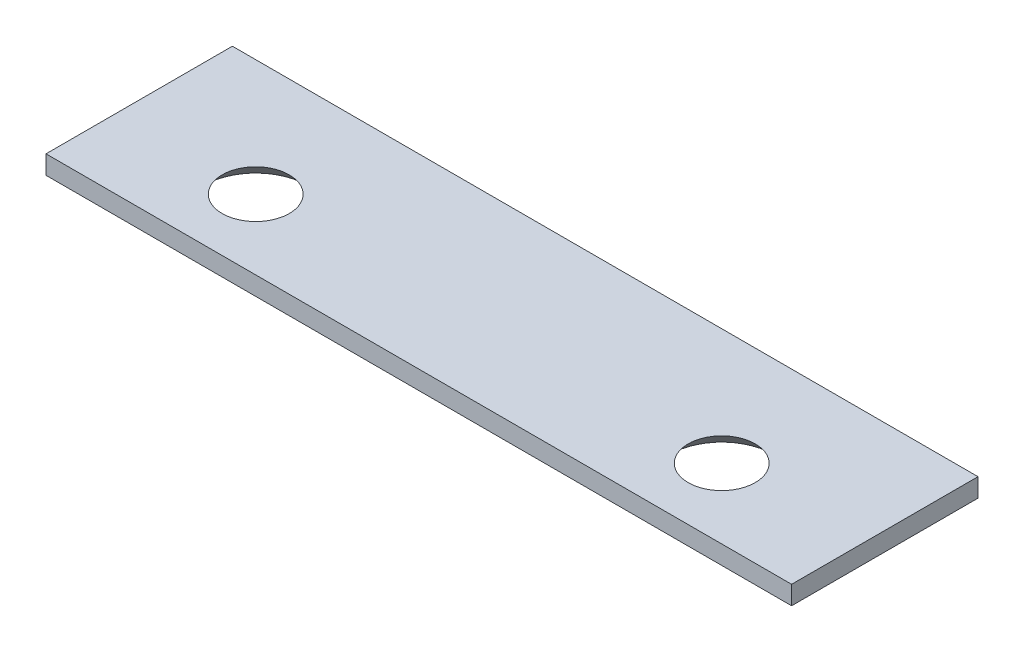
ISO-10303-21;
HEADER;
FILE_DESCRIPTION(('STEP AP214'),'2;1');
FILE_NAME('part.step','',(''),(''),'','','');
FILE_SCHEMA(('AUTOMOTIVE_DESIGN { 1 0 10303 214 1 1 1 1 }'));
ENDSEC;
DATA;
#1=APPLICATION_CONTEXT('core data for automotive mechanical design processes');
#2=APPLICATION_PROTOCOL_DEFINITION('international standard','automotive_design',2000,#1);
#3=PRODUCT_CONTEXT('',#1,'mechanical');
#4=PRODUCT('Part','Part','',(#3));
#5=PRODUCT_RELATED_PRODUCT_CATEGORY('part','',(#4));
#6=PRODUCT_DEFINITION_FORMATION('','',#4);
#7=PRODUCT_DEFINITION_CONTEXT('part definition',#1,'design');
#8=PRODUCT_DEFINITION('design','',#6,#7);
#9=PRODUCT_DEFINITION_SHAPE('','',#8);
#10=(LENGTH_UNIT() NAMED_UNIT(*) SI_UNIT(.MILLI.,.METRE.));
#11=(NAMED_UNIT(*) PLANE_ANGLE_UNIT() SI_UNIT($,.RADIAN.));
#12=(NAMED_UNIT(*) SI_UNIT($,.STERADIAN.) SOLID_ANGLE_UNIT());
#13=UNCERTAINTY_MEASURE_WITH_UNIT(LENGTH_MEASURE(1.E-05),#10,'distance_accuracy_value','');
#14=(GEOMETRIC_REPRESENTATION_CONTEXT(3) GLOBAL_UNCERTAINTY_ASSIGNED_CONTEXT((#13)) GLOBAL_UNIT_ASSIGNED_CONTEXT((#10,
#11,#12)) REPRESENTATION_CONTEXT('',''));
#15=CARTESIAN_POINT('',(0.,0.,0.));
#16=DIRECTION('',(0.,0.,1.));
#17=DIRECTION('',(1.,0.,0.));
#18=AXIS2_PLACEMENT_3D('',#15,#16,#17);
#19=CARTESIAN_POINT('',(0.,2.,0.));
#20=DIRECTION('',(0.,-1.,0.));
#21=DIRECTION('',(0.,0.,-1.));
#22=AXIS2_PLACEMENT_3D('',#19,#20,#21);
#23=PLANE('',#22);
#24=CARTESIAN_POINT('',(65.,2.,-7.5));
#25=DIRECTION('',(0.,-1.,0.));
#26=DIRECTION('',(0.,0.,-1.));
#27=AXIS2_PLACEMENT_3D('',#24,#25,#26);
#28=CIRCLE('',#27,3.6);
#29=CARTESIAN_POINT('',(65.,2.,-11.1));
#30=VERTEX_POINT('',#29);
#31=EDGE_CURVE('E21',#30,#30,#28,.T.);
#32=ORIENTED_EDGE('',*,*,#31,.T.);
#33=EDGE_LOOP('',(#32));
#34=FACE_BOUND('',#33,.T.);
#35=CARTESIAN_POINT('',(15.,2.,-7.5));
#36=DIRECTION('',(0.,-1.,0.));
#37=DIRECTION('',(0.,0.,-1.));
#38=AXIS2_PLACEMENT_3D('',#35,#36,#37);
#39=CIRCLE('',#38,3.6);
#40=CARTESIAN_POINT('',(15.,2.,-11.1));
#41=VERTEX_POINT('',#40);
#42=EDGE_CURVE('E86',#41,#41,#39,.T.);
#43=ORIENTED_EDGE('',*,*,#42,.T.);
#44=EDGE_LOOP('',(#43));
#45=FACE_BOUND('',#44,.T.);
#46=DIRECTION('',(0.,0.,1.));
#47=VECTOR('',#46,1.);
#48=CARTESIAN_POINT('',(0.,2.,0.));
#49=LINE('',#48,#47);
#50=CARTESIAN_POINT('',(0.,2.,-20.));
#51=VERTEX_POINT('',#50);
#52=CARTESIAN_POINT('',(0.,2.,0.));
#53=VERTEX_POINT('',#52);
#54=EDGE_CURVE('E70',#51,#53,#49,.T.);
#55=ORIENTED_EDGE('',*,*,#54,.T.);
#56=DIRECTION('',(1.,0.,0.));
#57=VECTOR('',#56,1.);
#58=CARTESIAN_POINT('',(0.,2.,0.));
#59=LINE('',#58,#57);
#60=CARTESIAN_POINT('',(80.,2.,0.));
#61=VERTEX_POINT('',#60);
#62=EDGE_CURVE('E66',#53,#61,#59,.T.);
#63=ORIENTED_EDGE('',*,*,#62,.T.);
#64=DIRECTION('',(0.,0.,-1.));
#65=VECTOR('',#64,1.);
#66=CARTESIAN_POINT('',(80.,2.,0.));
#67=LINE('',#66,#65);
#68=CARTESIAN_POINT('',(80.,2.,-20.));
#69=VERTEX_POINT('',#68);
#70=EDGE_CURVE('E68',#61,#69,#67,.T.);
#71=ORIENTED_EDGE('',*,*,#70,.T.);
#72=DIRECTION('',(-1.,0.,0.));
#73=VECTOR('',#72,1.);
#74=CARTESIAN_POINT('',(0.,2.,-20.));
#75=LINE('',#74,#73);
#76=EDGE_CURVE('E36',#69,#51,#75,.T.);
#77=ORIENTED_EDGE('',*,*,#76,.T.);
#78=EDGE_LOOP('',(#55,#63,#71,#77));
#79=FACE_BOUND('',#78,.T.);
#80=ADVANCED_FACE('F17',(#34,#45,#79),#23,.F.);
#81=CARTESIAN_POINT('',(0.,0.,0.));
#82=DIRECTION('',(0.,-1.,0.));
#83=DIRECTION('',(0.,0.,-1.));
#84=AXIS2_PLACEMENT_3D('',#81,#82,#83);
#85=PLANE('',#84);
#86=CARTESIAN_POINT('',(65.,0.,-7.5));
#87=DIRECTION('',(0.,-1.,0.));
#88=DIRECTION('',(0.,0.,-1.));
#89=AXIS2_PLACEMENT_3D('',#86,#87,#88);
#90=CIRCLE('',#89,5.6);
#91=CARTESIAN_POINT('',(65.,0.,-13.1));
#92=VERTEX_POINT('',#91);
#93=EDGE_CURVE('E100',#92,#92,#90,.T.);
#94=ORIENTED_EDGE('',*,*,#93,.F.);
#95=EDGE_LOOP('',(#94));
#96=FACE_BOUND('',#95,.T.);
#97=CARTESIAN_POINT('',(15.,0.,-7.5));
#98=DIRECTION('',(0.,-1.,0.));
#99=DIRECTION('',(0.,0.,-1.));
#100=AXIS2_PLACEMENT_3D('',#97,#98,#99);
#101=CIRCLE('',#100,5.6);
#102=CARTESIAN_POINT('',(15.,0.,-13.1));
#103=VERTEX_POINT('',#102);
#104=EDGE_CURVE('E92',#103,#103,#101,.T.);
#105=ORIENTED_EDGE('',*,*,#104,.F.);
#106=EDGE_LOOP('',(#105));
#107=FACE_BOUND('',#106,.T.);
#108=DIRECTION('',(0.,0.,1.));
#109=VECTOR('',#108,1.);
#110=CARTESIAN_POINT('',(0.,0.,0.));
#111=LINE('',#110,#109);
#112=CARTESIAN_POINT('',(0.,0.,-20.));
#113=VERTEX_POINT('',#112);
#114=CARTESIAN_POINT('',(0.,0.,0.));
#115=VERTEX_POINT('',#114);
#116=EDGE_CURVE('E83',#113,#115,#111,.T.);
#117=ORIENTED_EDGE('',*,*,#116,.F.);
#118=DIRECTION('',(-1.,0.,0.));
#119=VECTOR('',#118,1.);
#120=CARTESIAN_POINT('',(0.,0.,-20.));
#121=LINE('',#120,#119);
#122=CARTESIAN_POINT('',(80.,0.,-20.));
#123=VERTEX_POINT('',#122);
#124=EDGE_CURVE('E59',#123,#113,#121,.T.);
#125=ORIENTED_EDGE('',*,*,#124,.F.);
#126=DIRECTION('',(0.,0.,-1.));
#127=VECTOR('',#126,1.);
#128=CARTESIAN_POINT('',(80.,0.,0.));
#129=LINE('',#128,#127);
#130=CARTESIAN_POINT('',(80.,0.,0.));
#131=VERTEX_POINT('',#130);
#132=EDGE_CURVE('E53',#131,#123,#129,.T.);
#133=ORIENTED_EDGE('',*,*,#132,.F.);
#134=DIRECTION('',(1.,0.,0.));
#135=VECTOR('',#134,1.);
#136=CARTESIAN_POINT('',(0.,0.,0.));
#137=LINE('',#136,#135);
#138=EDGE_CURVE('E74',#115,#131,#137,.T.);
#139=ORIENTED_EDGE('',*,*,#138,.F.);
#140=EDGE_LOOP('',(#117,#125,#133,#139));
#141=FACE_BOUND('',#140,.T.);
#142=ADVANCED_FACE('F108',(#96,#107,#141),#85,.T.);
#143=CARTESIAN_POINT('',(0.,2.,0.));
#144=DIRECTION('',(1.,0.,0.));
#145=DIRECTION('',(0.,0.,-1.));
#146=AXIS2_PLACEMENT_3D('',#143,#144,#145);
#147=PLANE('',#146);
#148=ORIENTED_EDGE('',*,*,#116,.T.);
#149=DIRECTION('',(0.,-1.,0.));
#150=VECTOR('',#149,1.);
#151=CARTESIAN_POINT('',(0.,2.,0.));
#152=LINE('',#151,#150);
#153=EDGE_CURVE('E11',#53,#115,#152,.T.);
#154=ORIENTED_EDGE('',*,*,#153,.F.);
#155=ORIENTED_EDGE('',*,*,#54,.F.);
#156=DIRECTION('',(0.,-1.,0.));
#157=VECTOR('',#156,1.);
#158=CARTESIAN_POINT('',(0.,2.,-20.));
#159=LINE('',#158,#157);
#160=EDGE_CURVE('E79',#51,#113,#159,.T.);
#161=ORIENTED_EDGE('',*,*,#160,.T.);
#162=EDGE_LOOP('',(#148,#154,#155,#161));
#163=FACE_BOUND('',#162,.T.);
#164=ADVANCED_FACE('F19',(#163),#147,.F.);
#165=CARTESIAN_POINT('',(0.,2.,0.));
#166=DIRECTION('',(0.,0.,-1.));
#167=DIRECTION('',(-1.,0.,0.));
#168=AXIS2_PLACEMENT_3D('',#165,#166,#167);
#169=PLANE('',#168);
#170=ORIENTED_EDGE('',*,*,#138,.T.);
#171=DIRECTION('',(0.,-1.,0.));
#172=VECTOR('',#171,1.);
#173=CARTESIAN_POINT('',(80.,2.,0.));
#174=LINE('',#173,#172);
#175=EDGE_CURVE('E27',#61,#131,#174,.T.);
#176=ORIENTED_EDGE('',*,*,#175,.F.);
#177=ORIENTED_EDGE('',*,*,#62,.F.);
#178=ORIENTED_EDGE('',*,*,#153,.T.);
#179=EDGE_LOOP('',(#170,#176,#177,#178));
#180=FACE_BOUND('',#179,.T.);
#181=ADVANCED_FACE('F73',(#180),#169,.F.);
#182=CARTESIAN_POINT('',(80.,2.,0.));
#183=DIRECTION('',(-1.,0.,0.));
#184=DIRECTION('',(0.,0.,1.));
#185=AXIS2_PLACEMENT_3D('',#182,#183,#184);
#186=PLANE('',#185);
#187=ORIENTED_EDGE('',*,*,#132,.T.);
#188=DIRECTION('',(0.,-1.,0.));
#189=VECTOR('',#188,1.);
#190=CARTESIAN_POINT('',(80.,2.,-20.));
#191=LINE('',#190,#189);
#192=EDGE_CURVE('E75',#69,#123,#191,.T.);
#193=ORIENTED_EDGE('',*,*,#192,.F.);
#194=ORIENTED_EDGE('',*,*,#70,.F.);
#195=ORIENTED_EDGE('',*,*,#175,.T.);
#196=EDGE_LOOP('',(#187,#193,#194,#195));
#197=FACE_BOUND('',#196,.T.);
#198=ADVANCED_FACE('F77',(#197),#186,.F.);
#199=CARTESIAN_POINT('',(0.,2.,-20.));
#200=DIRECTION('',(0.,0.,1.));
#201=DIRECTION('',(1.,0.,0.));
#202=AXIS2_PLACEMENT_3D('',#199,#200,#201);
#203=PLANE('',#202);
#204=ORIENTED_EDGE('',*,*,#124,.T.);
#205=ORIENTED_EDGE('',*,*,#160,.F.);
#206=ORIENTED_EDGE('',*,*,#76,.F.);
#207=ORIENTED_EDGE('',*,*,#192,.T.);
#208=EDGE_LOOP('',(#204,#205,#206,#207));
#209=FACE_BOUND('',#208,.T.);
#210=ADVANCED_FACE('F115',(#209),#203,.F.);
#211=CARTESIAN_POINT('',(15.,0.,-7.5));
#212=DIRECTION('',(0.,-1.,0.));
#213=DIRECTION('',(0.,0.,-1.));
#214=AXIS2_PLACEMENT_3D('',#211,#212,#213);
#215=CONICAL_SURFACE('',#214,5.6,0.785398163397449);
#216=ORIENTED_EDGE('',*,*,#104,.T.);
#217=EDGE_LOOP('',(#216));
#218=FACE_BOUND('',#217,.T.);
#219=ORIENTED_EDGE('',*,*,#42,.F.);
#220=EDGE_LOOP('',(#219));
#221=FACE_BOUND('',#220,.T.);
#222=ADVANCED_FACE('F117',(#218,#221),#215,.F.);
#223=CARTESIAN_POINT('',(65.,0.,-7.5));
#224=DIRECTION('',(0.,-1.,0.));
#225=DIRECTION('',(0.,0.,-1.));
#226=AXIS2_PLACEMENT_3D('',#223,#224,#225);
#227=CONICAL_SURFACE('',#226,5.6,0.785398163397446);
#228=ORIENTED_EDGE('',*,*,#93,.T.);
#229=EDGE_LOOP('',(#228));
#230=FACE_BOUND('',#229,.T.);
#231=ORIENTED_EDGE('',*,*,#31,.F.);
#232=EDGE_LOOP('',(#231));
#233=FACE_BOUND('',#232,.T.);
#234=ADVANCED_FACE('F105',(#230,#233),#227,.F.);
#235=CLOSED_SHELL('',(#80,#142,#164,#181,#198,#210,#222,#234));
#236=MANIFOLD_SOLID_BREP('B1',#235);
#237=ADVANCED_BREP_SHAPE_REPRESENTATION('',(#18,#236),#14);
#238=SHAPE_DEFINITION_REPRESENTATION(#9,#237);
ENDSEC;
END-ISO-10303-21;
